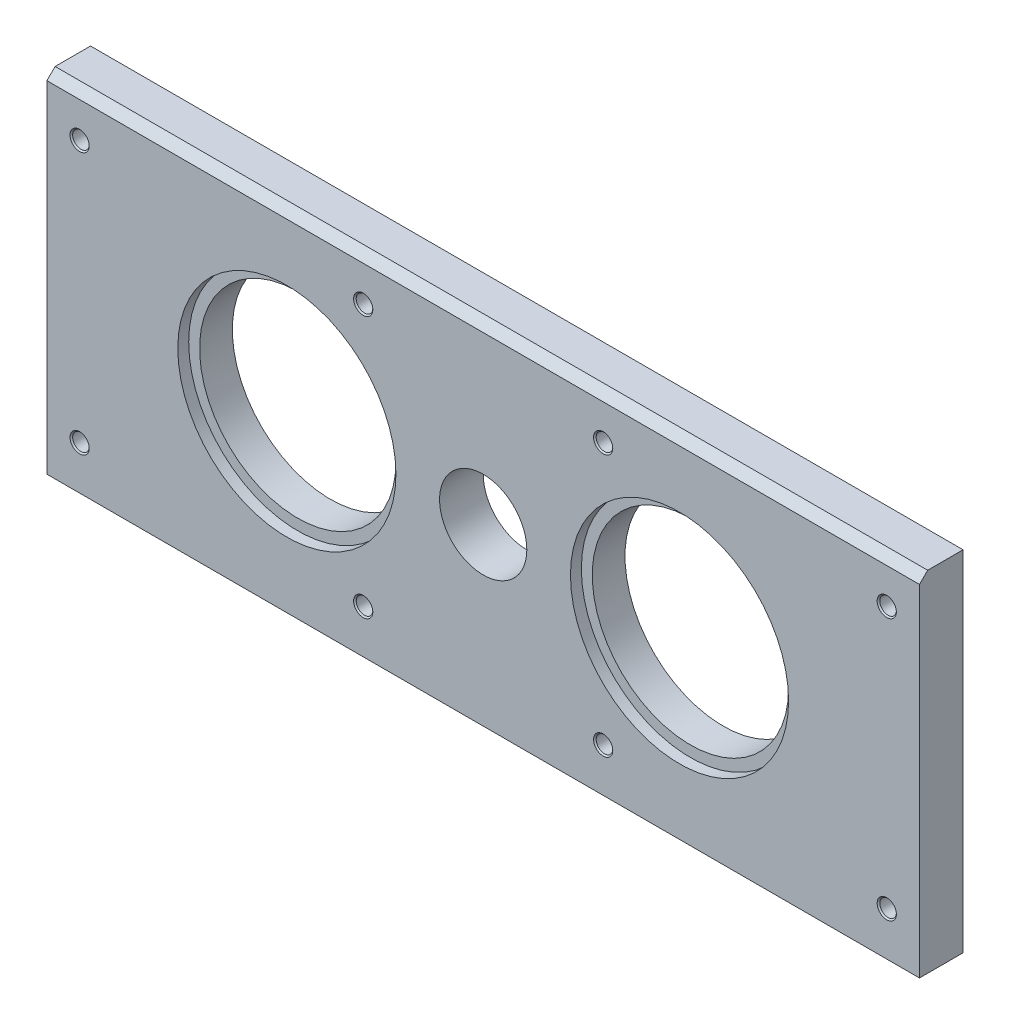
ISO-10303-21;
HEADER;
FILE_DESCRIPTION(('STEP AP214'),'2;1');
FILE_NAME('part.step','',(''),(''),'','','');
FILE_SCHEMA(('AUTOMOTIVE_DESIGN { 1 0 10303 214 1 1 1 1 }'));
ENDSEC;
DATA;
#1=APPLICATION_CONTEXT('core data for automotive mechanical design processes');
#2=APPLICATION_PROTOCOL_DEFINITION('international standard','automotive_design',2000,#1);
#3=PRODUCT_CONTEXT('',#1,'mechanical');
#4=PRODUCT('Part','Part','',(#3));
#5=PRODUCT_RELATED_PRODUCT_CATEGORY('part','',(#4));
#6=PRODUCT_DEFINITION_FORMATION('','',#4);
#7=PRODUCT_DEFINITION_CONTEXT('part definition',#1,'design');
#8=PRODUCT_DEFINITION('design','',#6,#7);
#9=PRODUCT_DEFINITION_SHAPE('','',#8);
#10=(LENGTH_UNIT() NAMED_UNIT(*) SI_UNIT(.MILLI.,.METRE.));
#11=(NAMED_UNIT(*) PLANE_ANGLE_UNIT() SI_UNIT($,.RADIAN.));
#12=(NAMED_UNIT(*) SI_UNIT($,.STERADIAN.) SOLID_ANGLE_UNIT());
#13=UNCERTAINTY_MEASURE_WITH_UNIT(LENGTH_MEASURE(1.E-05),#10,'distance_accuracy_value','');
#14=(GEOMETRIC_REPRESENTATION_CONTEXT(3) GLOBAL_UNCERTAINTY_ASSIGNED_CONTEXT((#13)) GLOBAL_UNIT_ASSIGNED_CONTEXT((#10,
#11,#12)) REPRESENTATION_CONTEXT('',''));
#15=CARTESIAN_POINT('',(0.,0.,0.));
#16=DIRECTION('',(0.,0.,1.));
#17=DIRECTION('',(1.,0.,0.));
#18=AXIS2_PLACEMENT_3D('',#15,#16,#17);
#19=CARTESIAN_POINT('',(57.15,0.,-12.7));
#20=DIRECTION('',(0.,0.,1.));
#21=DIRECTION('',(1.,0.,0.));
#22=AXIS2_PLACEMENT_3D('',#19,#20,#21);
#23=CYLINDRICAL_SURFACE('',#22,28.575);
#24=CARTESIAN_POINT('',(57.15,0.,-12.7));
#25=DIRECTION('',(0.,0.,1.));
#26=DIRECTION('',(1.,0.,0.));
#27=AXIS2_PLACEMENT_3D('',#24,#25,#26);
#28=CIRCLE('',#27,28.575);
#29=CARTESIAN_POINT('',(85.725,0.,-12.7));
#30=VERTEX_POINT('',#29);
#31=EDGE_CURVE('E154',#30,#30,#28,.T.);
#32=ORIENTED_EDGE('',*,*,#31,.F.);
#33=EDGE_LOOP('',(#32));
#34=FACE_BOUND('',#33,.T.);
#35=CARTESIAN_POINT('',(57.15,0.,-3.175));
#36=DIRECTION('',(0.,0.,1.));
#37=DIRECTION('',(1.,0.,0.));
#38=AXIS2_PLACEMENT_3D('',#35,#36,#37);
#39=CIRCLE('',#38,28.575);
#40=CARTESIAN_POINT('',(85.725,0.,-3.175));
#41=VERTEX_POINT('',#40);
#42=EDGE_CURVE('E123',#41,#41,#39,.F.);
#43=ORIENTED_EDGE('',*,*,#42,.F.);
#44=EDGE_LOOP('',(#43));
#45=FACE_BOUND('',#44,.T.);
#46=ADVANCED_FACE('F33',(#34,#45),#23,.F.);
#47=CARTESIAN_POINT('',(-57.15,0.,-12.7));
#48=DIRECTION('',(0.,0.,1.));
#49=DIRECTION('',(1.,0.,0.));
#50=AXIS2_PLACEMENT_3D('',#47,#48,#49);
#51=CYLINDRICAL_SURFACE('',#50,28.575);
#52=CARTESIAN_POINT('',(-57.15,0.,-12.7));
#53=DIRECTION('',(0.,0.,1.));
#54=DIRECTION('',(1.,0.,0.));
#55=AXIS2_PLACEMENT_3D('',#52,#53,#54);
#56=CIRCLE('',#55,28.575);
#57=CARTESIAN_POINT('',(-28.575,0.,-12.7));
#58=VERTEX_POINT('',#57);
#59=EDGE_CURVE('E86',#58,#58,#56,.T.);
#60=ORIENTED_EDGE('',*,*,#59,.F.);
#61=EDGE_LOOP('',(#60));
#62=FACE_BOUND('',#61,.T.);
#63=CARTESIAN_POINT('',(-57.15,0.,-3.175));
#64=DIRECTION('',(0.,0.,1.));
#65=DIRECTION('',(1.,0.,0.));
#66=AXIS2_PLACEMENT_3D('',#63,#64,#65);
#67=CIRCLE('',#66,28.575);
#68=CARTESIAN_POINT('',(-28.575,0.,-3.175));
#69=VERTEX_POINT('',#68);
#70=EDGE_CURVE('E118',#69,#69,#67,.F.);
#71=ORIENTED_EDGE('',*,*,#70,.F.);
#72=EDGE_LOOP('',(#71));
#73=FACE_BOUND('',#72,.T.);
#74=ADVANCED_FACE('F166',(#62,#73),#51,.F.);
#75=CARTESIAN_POINT('',(-127.,50.8,-12.7));
#76=DIRECTION('',(-1.,0.,0.));
#77=DIRECTION('',(0.,0.,1.));
#78=AXIS2_PLACEMENT_3D('',#75,#76,#77);
#79=PLANE('',#78);
#80=DIRECTION('',(0.,-1.,0.));
#81=VECTOR('',#80,1.);
#82=CARTESIAN_POINT('',(-127.,50.8,0.));
#83=LINE('',#82,#81);
#84=CARTESIAN_POINT('',(-127.,48.4124,0.));
#85=VERTEX_POINT('',#84);
#86=CARTESIAN_POINT('',(-127.,-50.8,0.));
#87=VERTEX_POINT('',#86);
#88=EDGE_CURVE('E78',#85,#87,#83,.T.);
#89=ORIENTED_EDGE('',*,*,#88,.F.);
#90=DIRECTION('',(0.,-0.707106781186547,0.707106781186548));
#91=VECTOR('',#90,1.);
#92=CARTESIAN_POINT('',(-127.,55.9562,-7.54380000000001));
#93=LINE('',#92,#91);
#94=CARTESIAN_POINT('',(-127.,50.8,-2.38760000000001));
#95=VERTEX_POINT('',#94);
#96=EDGE_CURVE('E55',#85,#95,#93,.F.);
#97=ORIENTED_EDGE('',*,*,#96,.T.);
#98=DIRECTION('',(0.,0.,1.));
#99=VECTOR('',#98,1.);
#100=CARTESIAN_POINT('',(-127.,50.8,-12.7));
#101=LINE('',#100,#99);
#102=CARTESIAN_POINT('',(-127.,50.8,-12.7));
#103=VERTEX_POINT('',#102);
#104=EDGE_CURVE('E113',#103,#95,#101,.T.);
#105=ORIENTED_EDGE('',*,*,#104,.F.);
#106=DIRECTION('',(0.,-1.,0.));
#107=VECTOR('',#106,1.);
#108=CARTESIAN_POINT('',(-127.,50.8,-12.7));
#109=LINE('',#108,#107);
#110=CARTESIAN_POINT('',(-127.,-50.8,-12.7));
#111=VERTEX_POINT('',#110);
#112=EDGE_CURVE('E91',#103,#111,#109,.T.);
#113=ORIENTED_EDGE('',*,*,#112,.T.);
#114=DIRECTION('',(0.,0.,1.));
#115=VECTOR('',#114,1.);
#116=CARTESIAN_POINT('',(-127.,-50.8,-12.7));
#117=LINE('',#116,#115);
#118=EDGE_CURVE('E89',#111,#87,#117,.T.);
#119=ORIENTED_EDGE('',*,*,#118,.T.);
#120=EDGE_LOOP('',(#89,#97,#105,#113,#119));
#121=FACE_BOUND('',#120,.T.);
#122=ADVANCED_FACE('F35',(#121),#79,.T.);
#123=CARTESIAN_POINT('',(-127.,50.8,-12.7));
#124=DIRECTION('',(0.,1.,0.));
#125=DIRECTION('',(0.,0.,1.));
#126=AXIS2_PLACEMENT_3D('',#123,#124,#125);
#127=PLANE('',#126);
#128=ORIENTED_EDGE('',*,*,#104,.T.);
#129=DIRECTION('',(1.,0.,0.));
#130=VECTOR('',#129,1.);
#131=CARTESIAN_POINT('',(-127.,50.8,-2.38760000000001));
#132=LINE('',#131,#130);
#133=CARTESIAN_POINT('',(127.,50.8,-2.3876));
#134=VERTEX_POINT('',#133);
#135=EDGE_CURVE('E41',#95,#134,#132,.T.);
#136=ORIENTED_EDGE('',*,*,#135,.T.);
#137=DIRECTION('',(0.,0.,1.));
#138=VECTOR('',#137,1.);
#139=CARTESIAN_POINT('',(127.,50.8,-12.7));
#140=LINE('',#139,#138);
#141=CARTESIAN_POINT('',(127.,50.8,-12.7));
#142=VERTEX_POINT('',#141);
#143=EDGE_CURVE('E115',#142,#134,#140,.T.);
#144=ORIENTED_EDGE('',*,*,#143,.F.);
#145=DIRECTION('',(-1.,0.,0.));
#146=VECTOR('',#145,1.);
#147=CARTESIAN_POINT('',(-127.,50.8,-12.7));
#148=LINE('',#147,#146);
#149=EDGE_CURVE('E96',#142,#103,#148,.T.);
#150=ORIENTED_EDGE('',*,*,#149,.T.);
#151=EDGE_LOOP('',(#128,#136,#144,#150));
#152=FACE_BOUND('',#151,.T.);
#153=ADVANCED_FACE('F202',(#152),#127,.T.);
#154=CARTESIAN_POINT('',(127.,50.8,-12.7));
#155=DIRECTION('',(1.,0.,0.));
#156=DIRECTION('',(0.,0.,-1.));
#157=AXIS2_PLACEMENT_3D('',#154,#155,#156);
#158=PLANE('',#157);
#159=ORIENTED_EDGE('',*,*,#143,.T.);
#160=DIRECTION('',(0.,0.707106781186547,-0.707106781186548));
#161=VECTOR('',#160,1.);
#162=CARTESIAN_POINT('',(127.,55.9562,-7.54380000000001));
#163=LINE('',#162,#161);
#164=CARTESIAN_POINT('',(127.,48.4124,0.));
#165=VERTEX_POINT('',#164);
#166=EDGE_CURVE('E11',#134,#165,#163,.F.);
#167=ORIENTED_EDGE('',*,*,#166,.T.);
#168=DIRECTION('',(0.,1.,0.));
#169=VECTOR('',#168,1.);
#170=CARTESIAN_POINT('',(127.,50.8,0.));
#171=LINE('',#170,#169);
#172=CARTESIAN_POINT('',(127.,-50.8,0.));
#173=VERTEX_POINT('',#172);
#174=EDGE_CURVE('E100',#173,#165,#171,.T.);
#175=ORIENTED_EDGE('',*,*,#174,.F.);
#176=DIRECTION('',(0.,0.,1.));
#177=VECTOR('',#176,1.);
#178=CARTESIAN_POINT('',(127.,-50.8,-12.7));
#179=LINE('',#178,#177);
#180=CARTESIAN_POINT('',(127.,-50.8,-12.7));
#181=VERTEX_POINT('',#180);
#182=EDGE_CURVE('E95',#181,#173,#179,.T.);
#183=ORIENTED_EDGE('',*,*,#182,.F.);
#184=DIRECTION('',(0.,1.,0.));
#185=VECTOR('',#184,1.);
#186=CARTESIAN_POINT('',(127.,50.8,-12.7));
#187=LINE('',#186,#185);
#188=EDGE_CURVE('E108',#181,#142,#187,.T.);
#189=ORIENTED_EDGE('',*,*,#188,.T.);
#190=EDGE_LOOP('',(#159,#167,#175,#183,#189));
#191=FACE_BOUND('',#190,.T.);
#192=ADVANCED_FACE('F205',(#191),#158,.T.);
#193=CARTESIAN_POINT('',(-127.,-50.8,-12.7));
#194=DIRECTION('',(0.,-1.,0.));
#195=DIRECTION('',(0.,0.,-1.));
#196=AXIS2_PLACEMENT_3D('',#193,#194,#195);
#197=PLANE('',#196);
#198=DIRECTION('',(1.,0.,0.));
#199=VECTOR('',#198,1.);
#200=CARTESIAN_POINT('',(-127.,-50.8,0.));
#201=LINE('',#200,#199);
#202=EDGE_CURVE('E83',#87,#173,#201,.T.);
#203=ORIENTED_EDGE('',*,*,#202,.F.);
#204=ORIENTED_EDGE('',*,*,#118,.F.);
#205=DIRECTION('',(1.,0.,0.));
#206=VECTOR('',#205,1.);
#207=CARTESIAN_POINT('',(-127.,-50.8,-12.7));
#208=LINE('',#207,#206);
#209=EDGE_CURVE('E106',#111,#181,#208,.T.);
#210=ORIENTED_EDGE('',*,*,#209,.T.);
#211=ORIENTED_EDGE('',*,*,#182,.T.);
#212=EDGE_LOOP('',(#203,#204,#210,#211));
#213=FACE_BOUND('',#212,.T.);
#214=ADVANCED_FACE('F98',(#213),#197,.T.);
#215=CARTESIAN_POINT('',(-127.,-50.8,-12.7));
#216=DIRECTION('',(0.,0.,1.));
#217=DIRECTION('',(1.,0.,0.));
#218=AXIS2_PLACEMENT_3D('',#215,#216,#217);
#219=PLANE('',#218);
#220=CARTESIAN_POINT('',(117.475,38.1,-12.7));
#221=DIRECTION('',(0.,0.,1.));
#222=DIRECTION('',(1.,0.,0.));
#223=AXIS2_PLACEMENT_3D('',#220,#221,#222);
#224=CIRCLE('',#223,2.41299999999998);
#225=CARTESIAN_POINT('',(119.888,38.1,-12.7));
#226=VERTEX_POINT('',#225);
#227=EDGE_CURVE('E529',#226,#226,#224,.T.);
#228=ORIENTED_EDGE('',*,*,#227,.T.);
#229=EDGE_LOOP('',(#228));
#230=FACE_BOUND('',#229,.T.);
#231=CARTESIAN_POINT('',(34.925,38.1,-12.7));
#232=DIRECTION('',(0.,0.,1.));
#233=DIRECTION('',(1.,0.,0.));
#234=AXIS2_PLACEMENT_3D('',#231,#232,#233);
#235=CIRCLE('',#234,2.41299999999998);
#236=CARTESIAN_POINT('',(37.338,38.1,-12.7));
#237=VERTEX_POINT('',#236);
#238=EDGE_CURVE('E540',#237,#237,#235,.T.);
#239=ORIENTED_EDGE('',*,*,#238,.T.);
#240=EDGE_LOOP('',(#239));
#241=FACE_BOUND('',#240,.T.);
#242=CARTESIAN_POINT('',(-34.925,38.1,-12.7));
#243=DIRECTION('',(0.,0.,1.));
#244=DIRECTION('',(1.,0.,0.));
#245=AXIS2_PLACEMENT_3D('',#242,#243,#244);
#246=CIRCLE('',#245,2.41299999999998);
#247=CARTESIAN_POINT('',(-32.512,38.1,-12.7));
#248=VERTEX_POINT('',#247);
#249=EDGE_CURVE('E549',#248,#248,#246,.T.);
#250=ORIENTED_EDGE('',*,*,#249,.T.);
#251=EDGE_LOOP('',(#250));
#252=FACE_BOUND('',#251,.T.);
#253=CARTESIAN_POINT('',(-117.475,38.1,-12.7));
#254=DIRECTION('',(0.,0.,1.));
#255=DIRECTION('',(1.,0.,0.));
#256=AXIS2_PLACEMENT_3D('',#253,#254,#255);
#257=CIRCLE('',#256,2.41299999999998);
#258=CARTESIAN_POINT('',(-115.062,38.1,-12.7));
#259=VERTEX_POINT('',#258);
#260=EDGE_CURVE('E558',#259,#259,#257,.T.);
#261=ORIENTED_EDGE('',*,*,#260,.T.);
#262=EDGE_LOOP('',(#261));
#263=FACE_BOUND('',#262,.T.);
#264=CARTESIAN_POINT('',(-117.475,-38.1,-12.7));
#265=DIRECTION('',(0.,0.,1.));
#266=DIRECTION('',(1.,0.,0.));
#267=AXIS2_PLACEMENT_3D('',#264,#265,#266);
#268=CIRCLE('',#267,2.41299999999998);
#269=CARTESIAN_POINT('',(-115.062,-38.1,-12.7));
#270=VERTEX_POINT('',#269);
#271=EDGE_CURVE('E567',#270,#270,#268,.T.);
#272=ORIENTED_EDGE('',*,*,#271,.T.);
#273=EDGE_LOOP('',(#272));
#274=FACE_BOUND('',#273,.T.);
#275=CARTESIAN_POINT('',(-34.925,-38.1,-12.7));
#276=DIRECTION('',(0.,0.,1.));
#277=DIRECTION('',(1.,0.,0.));
#278=AXIS2_PLACEMENT_3D('',#275,#276,#277);
#279=CIRCLE('',#278,2.41299999999998);
#280=CARTESIAN_POINT('',(-32.512,-38.1,-12.7));
#281=VERTEX_POINT('',#280);
#282=EDGE_CURVE('E576',#281,#281,#279,.T.);
#283=ORIENTED_EDGE('',*,*,#282,.T.);
#284=EDGE_LOOP('',(#283));
#285=FACE_BOUND('',#284,.T.);
#286=CARTESIAN_POINT('',(34.925,-38.1,-12.7));
#287=DIRECTION('',(0.,0.,1.));
#288=DIRECTION('',(1.,0.,0.));
#289=AXIS2_PLACEMENT_3D('',#286,#287,#288);
#290=CIRCLE('',#289,2.41299999999998);
#291=CARTESIAN_POINT('',(37.338,-38.1,-12.7));
#292=VERTEX_POINT('',#291);
#293=EDGE_CURVE('E585',#292,#292,#290,.T.);
#294=ORIENTED_EDGE('',*,*,#293,.T.);
#295=EDGE_LOOP('',(#294));
#296=FACE_BOUND('',#295,.T.);
#297=CARTESIAN_POINT('',(117.475,-38.1,-12.7));
#298=DIRECTION('',(0.,0.,1.));
#299=DIRECTION('',(1.,0.,0.));
#300=AXIS2_PLACEMENT_3D('',#297,#298,#299);
#301=CIRCLE('',#300,2.41299999999998);
#302=CARTESIAN_POINT('',(119.888,-38.1,-12.7));
#303=VERTEX_POINT('',#302);
#304=EDGE_CURVE('E143',#303,#303,#301,.T.);
#305=ORIENTED_EDGE('',*,*,#304,.T.);
#306=EDGE_LOOP('',(#305));
#307=FACE_BOUND('',#306,.T.);
#308=CARTESIAN_POINT('',(0.,0.,-12.7));
#309=DIRECTION('',(0.,0.,1.));
#310=DIRECTION('',(1.,0.,0.));
#311=AXIS2_PLACEMENT_3D('',#308,#309,#310);
#312=CIRCLE('',#311,12.7);
#313=CARTESIAN_POINT('',(12.7,0.,-12.7));
#314=VERTEX_POINT('',#313);
#315=EDGE_CURVE('E151',#314,#314,#312,.T.);
#316=ORIENTED_EDGE('',*,*,#315,.T.);
#317=EDGE_LOOP('',(#316));
#318=FACE_BOUND('',#317,.T.);
#319=ORIENTED_EDGE('',*,*,#31,.T.);
#320=EDGE_LOOP('',(#319));
#321=FACE_BOUND('',#320,.T.);
#322=ORIENTED_EDGE('',*,*,#59,.T.);
#323=EDGE_LOOP('',(#322));
#324=FACE_BOUND('',#323,.T.);
#325=ORIENTED_EDGE('',*,*,#112,.F.);
#326=ORIENTED_EDGE('',*,*,#149,.F.);
#327=ORIENTED_EDGE('',*,*,#188,.F.);
#328=ORIENTED_EDGE('',*,*,#209,.F.);
#329=EDGE_LOOP('',(#325,#326,#327,#328));
#330=FACE_BOUND('',#329,.T.);
#331=ADVANCED_FACE('F163',(#230,#241,#252,#263,#274,#285,#296,#307,#318,#321,#324,#330),#219,.F.);
#332=CARTESIAN_POINT('',(-127.,-50.8,0.));
#333=DIRECTION('',(0.,0.,1.));
#334=DIRECTION('',(1.,0.,0.));
#335=AXIS2_PLACEMENT_3D('',#332,#333,#334);
#336=PLANE('',#335);
#337=CARTESIAN_POINT('',(117.475,38.1,0.));
#338=DIRECTION('',(0.,0.,1.));
#339=DIRECTION('',(1.,0.,0.));
#340=AXIS2_PLACEMENT_3D('',#337,#338,#339);
#341=CIRCLE('',#340,2.794);
#342=CARTESIAN_POINT('',(120.269,38.1,0.));
#343=VERTEX_POINT('',#342);
#344=EDGE_CURVE('E527',#343,#343,#341,.T.);
#345=ORIENTED_EDGE('',*,*,#344,.F.);
#346=EDGE_LOOP('',(#345));
#347=FACE_BOUND('',#346,.T.);
#348=CARTESIAN_POINT('',(34.925,38.1,0.));
#349=DIRECTION('',(0.,0.,1.));
#350=DIRECTION('',(1.,0.,0.));
#351=AXIS2_PLACEMENT_3D('',#348,#349,#350);
#352=CIRCLE('',#351,2.794);
#353=CARTESIAN_POINT('',(37.719,38.1,0.));
#354=VERTEX_POINT('',#353);
#355=EDGE_CURVE('E534',#354,#354,#352,.T.);
#356=ORIENTED_EDGE('',*,*,#355,.F.);
#357=EDGE_LOOP('',(#356));
#358=FACE_BOUND('',#357,.T.);
#359=CARTESIAN_POINT('',(-34.925,38.1,0.));
#360=DIRECTION('',(0.,0.,1.));
#361=DIRECTION('',(1.,0.,0.));
#362=AXIS2_PLACEMENT_3D('',#359,#360,#361);
#363=CIRCLE('',#362,2.794);
#364=CARTESIAN_POINT('',(-32.131,38.1,0.));
#365=VERTEX_POINT('',#364);
#366=EDGE_CURVE('E543',#365,#365,#363,.T.);
#367=ORIENTED_EDGE('',*,*,#366,.F.);
#368=EDGE_LOOP('',(#367));
#369=FACE_BOUND('',#368,.T.);
#370=CARTESIAN_POINT('',(-117.475,38.1,0.));
#371=DIRECTION('',(0.,0.,1.));
#372=DIRECTION('',(1.,0.,0.));
#373=AXIS2_PLACEMENT_3D('',#370,#371,#372);
#374=CIRCLE('',#373,2.794);
#375=CARTESIAN_POINT('',(-114.681,38.1,0.));
#376=VERTEX_POINT('',#375);
#377=EDGE_CURVE('E552',#376,#376,#374,.T.);
#378=ORIENTED_EDGE('',*,*,#377,.F.);
#379=EDGE_LOOP('',(#378));
#380=FACE_BOUND('',#379,.T.);
#381=CARTESIAN_POINT('',(-117.475,-38.1,0.));
#382=DIRECTION('',(0.,0.,1.));
#383=DIRECTION('',(1.,0.,0.));
#384=AXIS2_PLACEMENT_3D('',#381,#382,#383);
#385=CIRCLE('',#384,2.794);
#386=CARTESIAN_POINT('',(-114.681,-38.1,0.));
#387=VERTEX_POINT('',#386);
#388=EDGE_CURVE('E561',#387,#387,#385,.T.);
#389=ORIENTED_EDGE('',*,*,#388,.F.);
#390=EDGE_LOOP('',(#389));
#391=FACE_BOUND('',#390,.T.);
#392=CARTESIAN_POINT('',(-34.925,-38.1,0.));
#393=DIRECTION('',(0.,0.,1.));
#394=DIRECTION('',(1.,0.,0.));
#395=AXIS2_PLACEMENT_3D('',#392,#393,#394);
#396=CIRCLE('',#395,2.794);
#397=CARTESIAN_POINT('',(-32.131,-38.1,0.));
#398=VERTEX_POINT('',#397);
#399=EDGE_CURVE('E570',#398,#398,#396,.T.);
#400=ORIENTED_EDGE('',*,*,#399,.F.);
#401=EDGE_LOOP('',(#400));
#402=FACE_BOUND('',#401,.T.);
#403=CARTESIAN_POINT('',(34.925,-38.1,0.));
#404=DIRECTION('',(0.,0.,1.));
#405=DIRECTION('',(1.,0.,0.));
#406=AXIS2_PLACEMENT_3D('',#403,#404,#405);
#407=CIRCLE('',#406,2.794);
#408=CARTESIAN_POINT('',(37.719,-38.1,0.));
#409=VERTEX_POINT('',#408);
#410=EDGE_CURVE('E579',#409,#409,#407,.T.);
#411=ORIENTED_EDGE('',*,*,#410,.F.);
#412=EDGE_LOOP('',(#411));
#413=FACE_BOUND('',#412,.T.);
#414=CARTESIAN_POINT('',(117.475,-38.1,0.));
#415=DIRECTION('',(0.,0.,1.));
#416=DIRECTION('',(1.,0.,0.));
#417=AXIS2_PLACEMENT_3D('',#414,#415,#416);
#418=CIRCLE('',#417,2.794);
#419=CARTESIAN_POINT('',(120.269,-38.1,0.));
#420=VERTEX_POINT('',#419);
#421=EDGE_CURVE('E588',#420,#420,#418,.T.);
#422=ORIENTED_EDGE('',*,*,#421,.F.);
#423=EDGE_LOOP('',(#422));
#424=FACE_BOUND('',#423,.T.);
#425=CARTESIAN_POINT('',(57.15,0.,0.));
#426=DIRECTION('',(0.,0.,1.));
#427=DIRECTION('',(1.,0.,0.));
#428=AXIS2_PLACEMENT_3D('',#425,#426,#427);
#429=CIRCLE('',#428,31.75);
#430=CARTESIAN_POINT('',(88.9,0.,0.));
#431=VERTEX_POINT('',#430);
#432=EDGE_CURVE('E135',#431,#431,#429,.T.);
#433=ORIENTED_EDGE('',*,*,#432,.F.);
#434=EDGE_LOOP('',(#433));
#435=FACE_BOUND('',#434,.T.);
#436=CARTESIAN_POINT('',(-57.15,0.,0.));
#437=DIRECTION('',(0.,0.,1.));
#438=DIRECTION('',(1.,0.,0.));
#439=AXIS2_PLACEMENT_3D('',#436,#437,#438);
#440=CIRCLE('',#439,31.75);
#441=CARTESIAN_POINT('',(-25.4,0.,0.));
#442=VERTEX_POINT('',#441);
#443=EDGE_CURVE('E126',#442,#442,#440,.T.);
#444=ORIENTED_EDGE('',*,*,#443,.F.);
#445=EDGE_LOOP('',(#444));
#446=FACE_BOUND('',#445,.T.);
#447=CARTESIAN_POINT('',(0.,0.,0.));
#448=DIRECTION('',(0.,0.,1.));
#449=DIRECTION('',(1.,0.,0.));
#450=AXIS2_PLACEMENT_3D('',#447,#448,#449);
#451=CIRCLE('',#450,12.7);
#452=CARTESIAN_POINT('',(12.7,0.,0.));
#453=VERTEX_POINT('',#452);
#454=EDGE_CURVE('E121',#453,#453,#451,.T.);
#455=ORIENTED_EDGE('',*,*,#454,.F.);
#456=EDGE_LOOP('',(#455));
#457=FACE_BOUND('',#456,.T.);
#458=ORIENTED_EDGE('',*,*,#174,.T.);
#459=DIRECTION('',(-1.,0.,0.));
#460=VECTOR('',#459,1.);
#461=CARTESIAN_POINT('',(-127.,48.4124,0.));
#462=LINE('',#461,#460);
#463=EDGE_CURVE('E85',#165,#85,#462,.T.);
#464=ORIENTED_EDGE('',*,*,#463,.T.);
#465=ORIENTED_EDGE('',*,*,#88,.T.);
#466=ORIENTED_EDGE('',*,*,#202,.T.);
#467=EDGE_LOOP('',(#458,#464,#465,#466));
#468=FACE_BOUND('',#467,.T.);
#469=ADVANCED_FACE('F81',(#347,#358,#369,#380,#391,#402,#413,#424,#435,#446,#457,#468),#336,.T.);
#470=CARTESIAN_POINT('',(0.,0.,-12.7));
#471=DIRECTION('',(0.,0.,1.));
#472=DIRECTION('',(1.,0.,0.));
#473=AXIS2_PLACEMENT_3D('',#470,#471,#472);
#474=CYLINDRICAL_SURFACE('',#473,12.7);
#475=ORIENTED_EDGE('',*,*,#315,.F.);
#476=EDGE_LOOP('',(#475));
#477=FACE_BOUND('',#476,.T.);
#478=ORIENTED_EDGE('',*,*,#454,.T.);
#479=EDGE_LOOP('',(#478));
#480=FACE_BOUND('',#479,.T.);
#481=ADVANCED_FACE('F175',(#477,#480),#474,.F.);
#482=CARTESIAN_POINT('',(-57.15,0.,-3.175));
#483=DIRECTION('',(0.,0.,1.));
#484=DIRECTION('',(1.,0.,0.));
#485=AXIS2_PLACEMENT_3D('',#482,#483,#484);
#486=PLANE('',#485);
#487=CARTESIAN_POINT('',(-57.15,0.,-3.175));
#488=DIRECTION('',(0.,0.,1.));
#489=DIRECTION('',(1.,0.,0.));
#490=AXIS2_PLACEMENT_3D('',#487,#488,#489);
#491=CIRCLE('',#490,31.75);
#492=CARTESIAN_POINT('',(-25.4,0.,-3.175));
#493=VERTEX_POINT('',#492);
#494=EDGE_CURVE('E122',#493,#493,#491,.T.);
#495=ORIENTED_EDGE('',*,*,#494,.T.);
#496=EDGE_LOOP('',(#495));
#497=FACE_BOUND('',#496,.T.);
#498=ORIENTED_EDGE('',*,*,#70,.T.);
#499=EDGE_LOOP('',(#498));
#500=FACE_BOUND('',#499,.T.);
#501=ADVANCED_FACE('F172',(#497,#500),#486,.T.);
#502=CARTESIAN_POINT('',(-57.15,0.,-3.175));
#503=DIRECTION('',(0.,0.,1.));
#504=DIRECTION('',(1.,0.,0.));
#505=AXIS2_PLACEMENT_3D('',#502,#503,#504);
#506=CYLINDRICAL_SURFACE('',#505,31.75);
#507=ORIENTED_EDGE('',*,*,#494,.F.);
#508=EDGE_LOOP('',(#507));
#509=FACE_BOUND('',#508,.T.);
#510=ORIENTED_EDGE('',*,*,#443,.T.);
#511=EDGE_LOOP('',(#510));
#512=FACE_BOUND('',#511,.T.);
#513=ADVANCED_FACE('F174',(#509,#512),#506,.F.);
#514=CARTESIAN_POINT('',(57.15,0.,-3.175));
#515=DIRECTION('',(0.,0.,1.));
#516=DIRECTION('',(1.,0.,0.));
#517=AXIS2_PLACEMENT_3D('',#514,#515,#516);
#518=PLANE('',#517);
#519=CARTESIAN_POINT('',(57.15,0.,-3.175));
#520=DIRECTION('',(0.,0.,1.));
#521=DIRECTION('',(1.,0.,0.));
#522=AXIS2_PLACEMENT_3D('',#519,#520,#521);
#523=CIRCLE('',#522,31.75);
#524=CARTESIAN_POINT('',(88.9,0.,-3.175));
#525=VERTEX_POINT('',#524);
#526=EDGE_CURVE('E127',#525,#525,#523,.T.);
#527=ORIENTED_EDGE('',*,*,#526,.T.);
#528=EDGE_LOOP('',(#527));
#529=FACE_BOUND('',#528,.T.);
#530=ORIENTED_EDGE('',*,*,#42,.T.);
#531=EDGE_LOOP('',(#530));
#532=FACE_BOUND('',#531,.T.);
#533=ADVANCED_FACE('F182',(#529,#532),#518,.T.);
#534=CARTESIAN_POINT('',(57.15,0.,-3.175));
#535=DIRECTION('',(0.,0.,1.));
#536=DIRECTION('',(1.,0.,0.));
#537=AXIS2_PLACEMENT_3D('',#534,#535,#536);
#538=CYLINDRICAL_SURFACE('',#537,31.75);
#539=ORIENTED_EDGE('',*,*,#526,.F.);
#540=EDGE_LOOP('',(#539));
#541=FACE_BOUND('',#540,.T.);
#542=ORIENTED_EDGE('',*,*,#432,.T.);
#543=EDGE_LOOP('',(#542));
#544=FACE_BOUND('',#543,.T.);
#545=ADVANCED_FACE('F244',(#541,#544),#538,.F.);
#546=CARTESIAN_POINT('',(117.475,-38.1,0.));
#547=DIRECTION('',(0.,0.,1.));
#548=DIRECTION('',(1.,0.,0.));
#549=AXIS2_PLACEMENT_3D('',#546,#547,#548);
#550=CYLINDRICAL_SURFACE('',#549,2.41299999999999);
#551=ORIENTED_EDGE('',*,*,#304,.F.);
#552=EDGE_LOOP('',(#551));
#553=FACE_BOUND('',#552,.T.);
#554=CARTESIAN_POINT('',(117.475,-38.1,-0.381000000000001));
#555=DIRECTION('',(0.,0.,1.));
#556=DIRECTION('',(1.,0.,0.));
#557=AXIS2_PLACEMENT_3D('',#554,#555,#556);
#558=CIRCLE('',#557,2.413);
#559=CARTESIAN_POINT('',(119.888,-38.1,-0.381000000000001));
#560=VERTEX_POINT('',#559);
#561=EDGE_CURVE('E591',#560,#560,#558,.T.);
#562=ORIENTED_EDGE('',*,*,#561,.T.);
#563=EDGE_LOOP('',(#562));
#564=FACE_BOUND('',#563,.T.);
#565=ADVANCED_FACE('F253',(#553,#564),#550,.F.);
#566=CARTESIAN_POINT('',(117.475,-38.1,0.));
#567=DIRECTION('',(0.,0.,1.));
#568=DIRECTION('',(1.,0.,0.));
#569=AXIS2_PLACEMENT_3D('',#566,#567,#568);
#570=CONICAL_SURFACE('',#569,2.794,0.785398163397453);
#571=ORIENTED_EDGE('',*,*,#561,.F.);
#572=EDGE_LOOP('',(#571));
#573=FACE_BOUND('',#572,.T.);
#574=ORIENTED_EDGE('',*,*,#421,.T.);
#575=EDGE_LOOP('',(#574));
#576=FACE_BOUND('',#575,.T.);
#577=ADVANCED_FACE('F262',(#573,#576),#570,.F.);
#578=CARTESIAN_POINT('',(34.925,-38.1,0.));
#579=DIRECTION('',(0.,0.,1.));
#580=DIRECTION('',(1.,0.,0.));
#581=AXIS2_PLACEMENT_3D('',#578,#579,#580);
#582=CYLINDRICAL_SURFACE('',#581,2.41299999999999);
#583=ORIENTED_EDGE('',*,*,#293,.F.);
#584=EDGE_LOOP('',(#583));
#585=FACE_BOUND('',#584,.T.);
#586=CARTESIAN_POINT('',(34.925,-38.1,-0.381000000000001));
#587=DIRECTION('',(0.,0.,1.));
#588=DIRECTION('',(1.,0.,0.));
#589=AXIS2_PLACEMENT_3D('',#586,#587,#588);
#590=CIRCLE('',#589,2.413);
#591=CARTESIAN_POINT('',(37.338,-38.1,-0.381000000000001));
#592=VERTEX_POINT('',#591);
#593=EDGE_CURVE('E582',#592,#592,#590,.T.);
#594=ORIENTED_EDGE('',*,*,#593,.T.);
#595=EDGE_LOOP('',(#594));
#596=FACE_BOUND('',#595,.T.);
#597=ADVANCED_FACE('F272',(#585,#596),#582,.F.);
#598=CARTESIAN_POINT('',(34.925,-38.1,0.));
#599=DIRECTION('',(0.,0.,1.));
#600=DIRECTION('',(1.,0.,0.));
#601=AXIS2_PLACEMENT_3D('',#598,#599,#600);
#602=CONICAL_SURFACE('',#601,2.794,0.785398163397444);
#603=ORIENTED_EDGE('',*,*,#593,.F.);
#604=EDGE_LOOP('',(#603));
#605=FACE_BOUND('',#604,.T.);
#606=ORIENTED_EDGE('',*,*,#410,.T.);
#607=EDGE_LOOP('',(#606));
#608=FACE_BOUND('',#607,.T.);
#609=ADVANCED_FACE('F282',(#605,#608),#602,.F.);
#610=CARTESIAN_POINT('',(-34.925,-38.1,0.));
#611=DIRECTION('',(0.,0.,1.));
#612=DIRECTION('',(1.,0.,0.));
#613=AXIS2_PLACEMENT_3D('',#610,#611,#612);
#614=CYLINDRICAL_SURFACE('',#613,2.41299999999999);
#615=ORIENTED_EDGE('',*,*,#282,.F.);
#616=EDGE_LOOP('',(#615));
#617=FACE_BOUND('',#616,.T.);
#618=CARTESIAN_POINT('',(-34.925,-38.1,-0.381000000000001));
#619=DIRECTION('',(0.,0.,1.));
#620=DIRECTION('',(1.,0.,0.));
#621=AXIS2_PLACEMENT_3D('',#618,#619,#620);
#622=CIRCLE('',#621,2.413);
#623=CARTESIAN_POINT('',(-32.512,-38.1,-0.381000000000001));
#624=VERTEX_POINT('',#623);
#625=EDGE_CURVE('E573',#624,#624,#622,.T.);
#626=ORIENTED_EDGE('',*,*,#625,.T.);
#627=EDGE_LOOP('',(#626));
#628=FACE_BOUND('',#627,.T.);
#629=ADVANCED_FACE('F292',(#617,#628),#614,.F.);
#630=CARTESIAN_POINT('',(-34.925,-38.1,0.));
#631=DIRECTION('',(0.,0.,1.));
#632=DIRECTION('',(1.,0.,0.));
#633=AXIS2_PLACEMENT_3D('',#630,#631,#632);
#634=CONICAL_SURFACE('',#633,2.794,0.785398163397444);
#635=ORIENTED_EDGE('',*,*,#625,.F.);
#636=EDGE_LOOP('',(#635));
#637=FACE_BOUND('',#636,.T.);
#638=ORIENTED_EDGE('',*,*,#399,.T.);
#639=EDGE_LOOP('',(#638));
#640=FACE_BOUND('',#639,.T.);
#641=ADVANCED_FACE('F302',(#637,#640),#634,.F.);
#642=CARTESIAN_POINT('',(-117.475,-38.1,0.));
#643=DIRECTION('',(0.,0.,1.));
#644=DIRECTION('',(1.,0.,0.));
#645=AXIS2_PLACEMENT_3D('',#642,#643,#644);
#646=CYLINDRICAL_SURFACE('',#645,2.41299999999999);
#647=ORIENTED_EDGE('',*,*,#271,.F.);
#648=EDGE_LOOP('',(#647));
#649=FACE_BOUND('',#648,.T.);
#650=CARTESIAN_POINT('',(-117.475,-38.1,-0.381000000000001));
#651=DIRECTION('',(0.,0.,1.));
#652=DIRECTION('',(1.,0.,0.));
#653=AXIS2_PLACEMENT_3D('',#650,#651,#652);
#654=CIRCLE('',#653,2.413);
#655=CARTESIAN_POINT('',(-115.062,-38.1,-0.381000000000001));
#656=VERTEX_POINT('',#655);
#657=EDGE_CURVE('E564',#656,#656,#654,.T.);
#658=ORIENTED_EDGE('',*,*,#657,.T.);
#659=EDGE_LOOP('',(#658));
#660=FACE_BOUND('',#659,.T.);
#661=ADVANCED_FACE('F312',(#649,#660),#646,.F.);
#662=CARTESIAN_POINT('',(-117.475,-38.1,0.));
#663=DIRECTION('',(0.,0.,1.));
#664=DIRECTION('',(1.,0.,0.));
#665=AXIS2_PLACEMENT_3D('',#662,#663,#664);
#666=CONICAL_SURFACE('',#665,2.794,0.785398163397453);
#667=ORIENTED_EDGE('',*,*,#657,.F.);
#668=EDGE_LOOP('',(#667));
#669=FACE_BOUND('',#668,.T.);
#670=ORIENTED_EDGE('',*,*,#388,.T.);
#671=EDGE_LOOP('',(#670));
#672=FACE_BOUND('',#671,.T.);
#673=ADVANCED_FACE('F322',(#669,#672),#666,.F.);
#674=CARTESIAN_POINT('',(-117.475,38.1,0.));
#675=DIRECTION('',(0.,0.,1.));
#676=DIRECTION('',(1.,0.,0.));
#677=AXIS2_PLACEMENT_3D('',#674,#675,#676);
#678=CYLINDRICAL_SURFACE('',#677,2.41299999999999);
#679=ORIENTED_EDGE('',*,*,#260,.F.);
#680=EDGE_LOOP('',(#679));
#681=FACE_BOUND('',#680,.T.);
#682=CARTESIAN_POINT('',(-117.475,38.1,-0.381000000000001));
#683=DIRECTION('',(0.,0.,1.));
#684=DIRECTION('',(1.,0.,0.));
#685=AXIS2_PLACEMENT_3D('',#682,#683,#684);
#686=CIRCLE('',#685,2.413);
#687=CARTESIAN_POINT('',(-115.062,38.1,-0.381000000000001));
#688=VERTEX_POINT('',#687);
#689=EDGE_CURVE('E555',#688,#688,#686,.T.);
#690=ORIENTED_EDGE('',*,*,#689,.T.);
#691=EDGE_LOOP('',(#690));
#692=FACE_BOUND('',#691,.T.);
#693=ADVANCED_FACE('F332',(#681,#692),#678,.F.);
#694=CARTESIAN_POINT('',(-117.475,38.1,0.));
#695=DIRECTION('',(0.,0.,1.));
#696=DIRECTION('',(1.,0.,0.));
#697=AXIS2_PLACEMENT_3D('',#694,#695,#696);
#698=CONICAL_SURFACE('',#697,2.794,0.785398163397453);
#699=ORIENTED_EDGE('',*,*,#689,.F.);
#700=EDGE_LOOP('',(#699));
#701=FACE_BOUND('',#700,.T.);
#702=ORIENTED_EDGE('',*,*,#377,.T.);
#703=EDGE_LOOP('',(#702));
#704=FACE_BOUND('',#703,.T.);
#705=ADVANCED_FACE('F342',(#701,#704),#698,.F.);
#706=CARTESIAN_POINT('',(-34.925,38.1,0.));
#707=DIRECTION('',(0.,0.,1.));
#708=DIRECTION('',(1.,0.,0.));
#709=AXIS2_PLACEMENT_3D('',#706,#707,#708);
#710=CYLINDRICAL_SURFACE('',#709,2.41299999999999);
#711=ORIENTED_EDGE('',*,*,#249,.F.);
#712=EDGE_LOOP('',(#711));
#713=FACE_BOUND('',#712,.T.);
#714=CARTESIAN_POINT('',(-34.925,38.1,-0.381000000000001));
#715=DIRECTION('',(0.,0.,1.));
#716=DIRECTION('',(1.,0.,0.));
#717=AXIS2_PLACEMENT_3D('',#714,#715,#716);
#718=CIRCLE('',#717,2.413);
#719=CARTESIAN_POINT('',(-32.512,38.1,-0.381000000000001));
#720=VERTEX_POINT('',#719);
#721=EDGE_CURVE('E546',#720,#720,#718,.T.);
#722=ORIENTED_EDGE('',*,*,#721,.T.);
#723=EDGE_LOOP('',(#722));
#724=FACE_BOUND('',#723,.T.);
#725=ADVANCED_FACE('F352',(#713,#724),#710,.F.);
#726=CARTESIAN_POINT('',(-34.925,38.1,0.));
#727=DIRECTION('',(0.,0.,1.));
#728=DIRECTION('',(1.,0.,0.));
#729=AXIS2_PLACEMENT_3D('',#726,#727,#728);
#730=CONICAL_SURFACE('',#729,2.794,0.785398163397444);
#731=ORIENTED_EDGE('',*,*,#721,.F.);
#732=EDGE_LOOP('',(#731));
#733=FACE_BOUND('',#732,.T.);
#734=ORIENTED_EDGE('',*,*,#366,.T.);
#735=EDGE_LOOP('',(#734));
#736=FACE_BOUND('',#735,.T.);
#737=ADVANCED_FACE('F362',(#733,#736),#730,.F.);
#738=CARTESIAN_POINT('',(34.925,38.1,0.));
#739=DIRECTION('',(0.,0.,1.));
#740=DIRECTION('',(1.,0.,0.));
#741=AXIS2_PLACEMENT_3D('',#738,#739,#740);
#742=CYLINDRICAL_SURFACE('',#741,2.41299999999999);
#743=ORIENTED_EDGE('',*,*,#238,.F.);
#744=EDGE_LOOP('',(#743));
#745=FACE_BOUND('',#744,.T.);
#746=CARTESIAN_POINT('',(34.925,38.1,-0.381000000000001));
#747=DIRECTION('',(0.,0.,1.));
#748=DIRECTION('',(1.,0.,0.));
#749=AXIS2_PLACEMENT_3D('',#746,#747,#748);
#750=CIRCLE('',#749,2.413);
#751=CARTESIAN_POINT('',(37.338,38.1,-0.381000000000001));
#752=VERTEX_POINT('',#751);
#753=EDGE_CURVE('E537',#752,#752,#750,.T.);
#754=ORIENTED_EDGE('',*,*,#753,.T.);
#755=EDGE_LOOP('',(#754));
#756=FACE_BOUND('',#755,.T.);
#757=ADVANCED_FACE('F372',(#745,#756),#742,.F.);
#758=CARTESIAN_POINT('',(34.925,38.1,0.));
#759=DIRECTION('',(0.,0.,1.));
#760=DIRECTION('',(1.,0.,0.));
#761=AXIS2_PLACEMENT_3D('',#758,#759,#760);
#762=CONICAL_SURFACE('',#761,2.794,0.785398163397444);
#763=ORIENTED_EDGE('',*,*,#753,.F.);
#764=EDGE_LOOP('',(#763));
#765=FACE_BOUND('',#764,.T.);
#766=ORIENTED_EDGE('',*,*,#355,.T.);
#767=EDGE_LOOP('',(#766));
#768=FACE_BOUND('',#767,.T.);
#769=ADVANCED_FACE('F382',(#765,#768),#762,.F.);
#770=CARTESIAN_POINT('',(117.475,38.1,0.));
#771=DIRECTION('',(0.,0.,1.));
#772=DIRECTION('',(1.,0.,0.));
#773=AXIS2_PLACEMENT_3D('',#770,#771,#772);
#774=CYLINDRICAL_SURFACE('',#773,2.41299999999999);
#775=ORIENTED_EDGE('',*,*,#227,.F.);
#776=EDGE_LOOP('',(#775));
#777=FACE_BOUND('',#776,.T.);
#778=CARTESIAN_POINT('',(117.475,38.1,-0.381000000000001));
#779=DIRECTION('',(0.,0.,1.));
#780=DIRECTION('',(1.,0.,0.));
#781=AXIS2_PLACEMENT_3D('',#778,#779,#780);
#782=CIRCLE('',#781,2.413);
#783=CARTESIAN_POINT('',(119.888,38.1,-0.381000000000001));
#784=VERTEX_POINT('',#783);
#785=EDGE_CURVE('E524',#784,#784,#782,.T.);
#786=ORIENTED_EDGE('',*,*,#785,.T.);
#787=EDGE_LOOP('',(#786));
#788=FACE_BOUND('',#787,.T.);
#789=ADVANCED_FACE('F392',(#777,#788),#774,.F.);
#790=CARTESIAN_POINT('',(117.475,38.1,0.));
#791=DIRECTION('',(0.,0.,1.));
#792=DIRECTION('',(1.,0.,0.));
#793=AXIS2_PLACEMENT_3D('',#790,#791,#792);
#794=CONICAL_SURFACE('',#793,2.794,0.785398163397453);
#795=ORIENTED_EDGE('',*,*,#785,.F.);
#796=EDGE_LOOP('',(#795));
#797=FACE_BOUND('',#796,.T.);
#798=ORIENTED_EDGE('',*,*,#344,.T.);
#799=EDGE_LOOP('',(#798));
#800=FACE_BOUND('',#799,.T.);
#801=ADVANCED_FACE('F402',(#797,#800),#794,.F.);
#802=CARTESIAN_POINT('',(-127.,48.4124,0.));
#803=DIRECTION('',(0.,-0.707106781186548,-0.707106781186547));
#804=DIRECTION('',(0.,0.707106781186547,-0.707106781186548));
#805=AXIS2_PLACEMENT_3D('',#802,#803,#804);
#806=PLANE('',#805);
#807=ORIENTED_EDGE('',*,*,#166,.F.);
#808=ORIENTED_EDGE('',*,*,#135,.F.);
#809=ORIENTED_EDGE('',*,*,#96,.F.);
#810=ORIENTED_EDGE('',*,*,#463,.F.);
#811=EDGE_LOOP('',(#807,#808,#809,#810));
#812=FACE_BOUND('',#811,.T.);
#813=ADVANCED_FACE('F412',(#812),#806,.F.);
#814=CLOSED_SHELL('',(#46,#74,#122,#153,#192,#214,#331,#469,#481,#501,#513,#533,#545,#565,#577,
#597,#609,#629,#641,#661,#673,#693,#705,#725,#737,#757,#769,#789,#801,#813));
#815=MANIFOLD_SOLID_BREP('B2',#814);
#816=ADVANCED_BREP_SHAPE_REPRESENTATION('',(#18,#815),#14);
#817=SHAPE_DEFINITION_REPRESENTATION(#9,#816);
ENDSEC;
END-ISO-10303-21;
